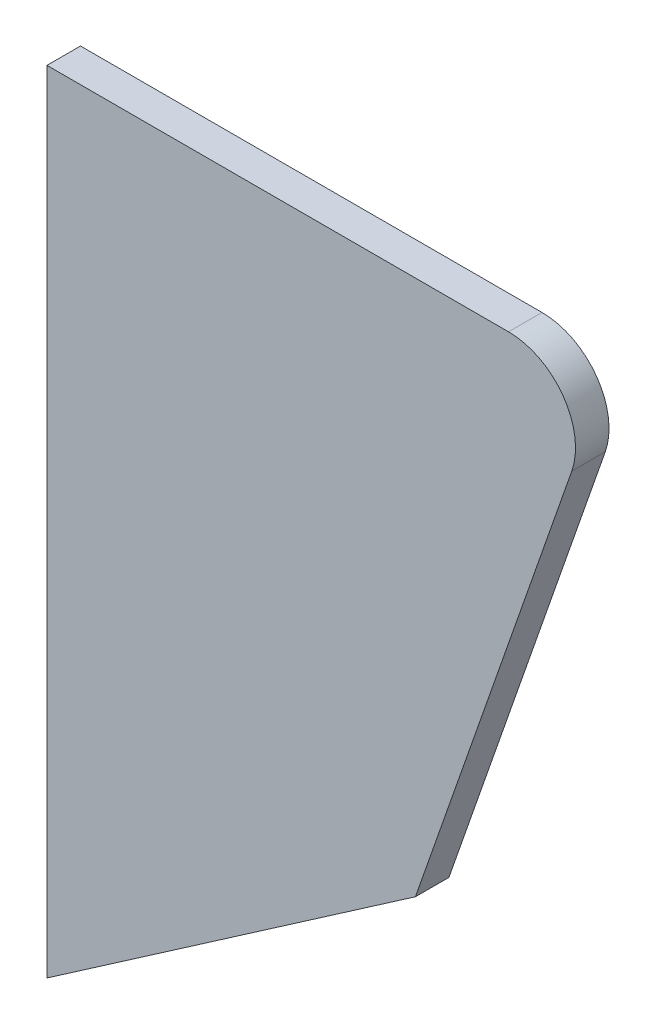
ISO-10303-21;
HEADER;
FILE_DESCRIPTION(('STEP AP214'),'2;1');
FILE_NAME('part.step','',(''),(''),'','','');
FILE_SCHEMA(('AUTOMOTIVE_DESIGN { 1 0 10303 214 1 1 1 1 }'));
ENDSEC;
DATA;
#1=APPLICATION_CONTEXT('core data for automotive mechanical design processes');
#2=APPLICATION_PROTOCOL_DEFINITION('international standard','automotive_design',2000,#1);
#3=PRODUCT_CONTEXT('',#1,'mechanical');
#4=PRODUCT('Part','Part','',(#3));
#5=PRODUCT_RELATED_PRODUCT_CATEGORY('part','',(#4));
#6=PRODUCT_DEFINITION_FORMATION('','',#4);
#7=PRODUCT_DEFINITION_CONTEXT('part definition',#1,'design');
#8=PRODUCT_DEFINITION('design','',#6,#7);
#9=PRODUCT_DEFINITION_SHAPE('','',#8);
#10=(LENGTH_UNIT() NAMED_UNIT(*) SI_UNIT(.MILLI.,.METRE.));
#11=(NAMED_UNIT(*) PLANE_ANGLE_UNIT() SI_UNIT($,.RADIAN.));
#12=(NAMED_UNIT(*) SI_UNIT($,.STERADIAN.) SOLID_ANGLE_UNIT());
#13=UNCERTAINTY_MEASURE_WITH_UNIT(LENGTH_MEASURE(1.E-05),#10,'distance_accuracy_value','');
#14=(GEOMETRIC_REPRESENTATION_CONTEXT(3) GLOBAL_UNCERTAINTY_ASSIGNED_CONTEXT((#13)) GLOBAL_UNIT_ASSIGNED_CONTEXT((#10,
#11,#12)) REPRESENTATION_CONTEXT('',''));
#15=CARTESIAN_POINT('',(0.,0.,0.));
#16=DIRECTION('',(0.,0.,1.));
#17=DIRECTION('',(1.,0.,0.));
#18=AXIS2_PLACEMENT_3D('',#15,#16,#17);
#19=CARTESIAN_POINT('',(13.5,0.,5.));
#20=DIRECTION('',(-0.568431869955349,0.822730338093269,0.));
#21=DIRECTION('',(-0.822730338093269,-0.568431869955349,0.));
#22=AXIS2_PLACEMENT_3D('',#19,#20,#21);
#23=PLANE('',#22);
#24=DIRECTION('',(0.822730338093269,0.568431869955349,0.));
#25=VECTOR('',#24,1.);
#26=CARTESIAN_POINT('',(13.5,0.,0.));
#27=LINE('',#26,#25);
#28=CARTESIAN_POINT('',(-41.5,-38.,0.));
#29=VERTEX_POINT('',#28);
#30=CARTESIAN_POINT('',(13.5,0.,0.));
#31=VERTEX_POINT('',#30);
#32=EDGE_CURVE('E118',#29,#31,#27,.T.);
#33=ORIENTED_EDGE('',*,*,#32,.T.);
#34=DIRECTION('',(0.,0.,-1.));
#35=VECTOR('',#34,1.);
#36=CARTESIAN_POINT('',(13.5,0.,5.));
#37=LINE('',#36,#35);
#38=CARTESIAN_POINT('',(13.5,0.,5.));
#39=VERTEX_POINT('',#38);
#40=EDGE_CURVE('E11',#39,#31,#37,.T.);
#41=ORIENTED_EDGE('',*,*,#40,.F.);
#42=DIRECTION('',(0.822730338093269,0.568431869955349,0.));
#43=VECTOR('',#42,1.);
#44=CARTESIAN_POINT('',(13.5,0.,5.));
#45=LINE('',#44,#43);
#46=CARTESIAN_POINT('',(-41.5,-38.,5.));
#47=VERTEX_POINT('',#46);
#48=EDGE_CURVE('E131',#47,#39,#45,.T.);
#49=ORIENTED_EDGE('',*,*,#48,.F.);
#50=DIRECTION('',(0.,0.,-1.));
#51=VECTOR('',#50,1.);
#52=CARTESIAN_POINT('',(-41.5,-38.,5.));
#53=LINE('',#52,#51);
#54=EDGE_CURVE('E114',#47,#29,#53,.T.);
#55=ORIENTED_EDGE('',*,*,#54,.T.);
#56=EDGE_LOOP('',(#33,#41,#49,#55));
#57=FACE_BOUND('',#56,.T.);
#58=ADVANCED_FACE('F39',(#57),#23,.F.);
#59=CARTESIAN_POINT('',(36.8437735134516,66.6964957527189,5.));
#60=DIRECTION('',(-0.943858356366017,0.330350424728106,0.));
#61=DIRECTION('',(-0.330350424728106,-0.943858356366017,0.));
#62=AXIS2_PLACEMENT_3D('',#59,#60,#61);
#63=PLANE('',#62);
#64=DIRECTION('',(0.330350424728106,0.943858356366017,0.));
#65=VECTOR('',#64,1.);
#66=CARTESIAN_POINT('',(36.8437735134516,66.6964957527189,0.));
#67=LINE('',#66,#65);
#68=CARTESIAN_POINT('',(36.8437735134516,66.6964957527189,0.));
#69=VERTEX_POINT('',#68);
#70=EDGE_CURVE('E122',#31,#69,#67,.T.);
#71=ORIENTED_EDGE('',*,*,#70,.T.);
#72=DIRECTION('',(0.,0.,-1.));
#73=VECTOR('',#72,1.);
#74=CARTESIAN_POINT('',(36.8437735134516,66.6964957527189,5.));
#75=LINE('',#74,#73);
#76=CARTESIAN_POINT('',(36.8437735134516,66.6964957527189,5.));
#77=VERTEX_POINT('',#76);
#78=EDGE_CURVE('E48',#77,#69,#75,.T.);
#79=ORIENTED_EDGE('',*,*,#78,.F.);
#80=DIRECTION('',(0.330350424728106,0.943858356366017,0.));
#81=VECTOR('',#80,1.);
#82=CARTESIAN_POINT('',(36.8437735134516,66.6964957527189,5.));
#83=LINE('',#82,#81);
#84=EDGE_CURVE('E90',#39,#77,#83,.T.);
#85=ORIENTED_EDGE('',*,*,#84,.F.);
#86=ORIENTED_EDGE('',*,*,#40,.T.);
#87=EDGE_LOOP('',(#71,#79,#85,#86));
#88=FACE_BOUND('',#87,.T.);
#89=ADVANCED_FACE('F153',(#88),#63,.F.);
#90=CARTESIAN_POINT('',(27.4051899497915,70.,5.));
#91=DIRECTION('',(0.,0.,-1.));
#92=DIRECTION('',(-1.,0.,0.));
#93=AXIS2_PLACEMENT_3D('',#90,#91,#92);
#94=CYLINDRICAL_SURFACE('',#93,10.);
#95=CARTESIAN_POINT('',(27.4051899497915,70.,0.));
#96=DIRECTION('',(0.,0.,1.));
#97=DIRECTION('',(-1.,0.,0.));
#98=AXIS2_PLACEMENT_3D('',#95,#96,#97);
#99=CIRCLE('',#98,10.);
#100=CARTESIAN_POINT('',(27.4051899497914,80.,0.));
#101=VERTEX_POINT('',#100);
#102=EDGE_CURVE('E106',#69,#101,#99,.T.);
#103=ORIENTED_EDGE('',*,*,#102,.T.);
#104=DIRECTION('',(0.,0.,-1.));
#105=VECTOR('',#104,1.);
#106=CARTESIAN_POINT('',(27.4051899497914,80.,5.));
#107=LINE('',#106,#105);
#108=CARTESIAN_POINT('',(27.4051899497914,80.,5.));
#109=VERTEX_POINT('',#108);
#110=EDGE_CURVE('E103',#109,#101,#107,.T.);
#111=ORIENTED_EDGE('',*,*,#110,.F.);
#112=CARTESIAN_POINT('',(27.4051899497915,70.,5.));
#113=DIRECTION('',(0.,0.,1.));
#114=DIRECTION('',(-1.,0.,0.));
#115=AXIS2_PLACEMENT_3D('',#112,#113,#114);
#116=CIRCLE('',#115,10.);
#117=EDGE_CURVE('E94',#77,#109,#116,.T.);
#118=ORIENTED_EDGE('',*,*,#117,.F.);
#119=ORIENTED_EDGE('',*,*,#78,.T.);
#120=EDGE_LOOP('',(#103,#111,#118,#119));
#121=FACE_BOUND('',#120,.T.);
#122=ADVANCED_FACE('F104',(#121),#94,.T.);
#123=CARTESIAN_POINT('',(-41.5,80.,5.));
#124=DIRECTION('',(0.,-1.,0.));
#125=DIRECTION('',(1.,0.,0.));
#126=AXIS2_PLACEMENT_3D('',#123,#124,#125);
#127=PLANE('',#126);
#128=DIRECTION('',(-1.,0.,0.));
#129=VECTOR('',#128,1.);
#130=CARTESIAN_POINT('',(-41.5,80.,0.));
#131=LINE('',#130,#129);
#132=CARTESIAN_POINT('',(-41.5,80.,0.));
#133=VERTEX_POINT('',#132);
#134=EDGE_CURVE('E76',#101,#133,#131,.T.);
#135=ORIENTED_EDGE('',*,*,#134,.T.);
#136=DIRECTION('',(0.,0.,-1.));
#137=VECTOR('',#136,1.);
#138=CARTESIAN_POINT('',(-41.5,80.,5.));
#139=LINE('',#138,#137);
#140=CARTESIAN_POINT('',(-41.5,80.,5.));
#141=VERTEX_POINT('',#140);
#142=EDGE_CURVE('E108',#141,#133,#139,.T.);
#143=ORIENTED_EDGE('',*,*,#142,.F.);
#144=DIRECTION('',(-1.,0.,0.));
#145=VECTOR('',#144,1.);
#146=CARTESIAN_POINT('',(-41.5,80.,5.));
#147=LINE('',#146,#145);
#148=EDGE_CURVE('E98',#109,#141,#147,.T.);
#149=ORIENTED_EDGE('',*,*,#148,.F.);
#150=ORIENTED_EDGE('',*,*,#110,.T.);
#151=EDGE_LOOP('',(#135,#143,#149,#150));
#152=FACE_BOUND('',#151,.T.);
#153=ADVANCED_FACE('F110',(#152),#127,.F.);
#154=CARTESIAN_POINT('',(-41.5,-38.,5.));
#155=DIRECTION('',(1.,0.,0.));
#156=DIRECTION('',(0.,0.,-1.));
#157=AXIS2_PLACEMENT_3D('',#154,#155,#156);
#158=PLANE('',#157);
#159=DIRECTION('',(0.,-1.,0.));
#160=VECTOR('',#159,1.);
#161=CARTESIAN_POINT('',(-41.5,-38.,0.));
#162=LINE('',#161,#160);
#163=EDGE_CURVE('E82',#133,#29,#162,.T.);
#164=ORIENTED_EDGE('',*,*,#163,.T.);
#165=ORIENTED_EDGE('',*,*,#54,.F.);
#166=DIRECTION('',(0.,-1.,0.));
#167=VECTOR('',#166,1.);
#168=CARTESIAN_POINT('',(-41.5,-38.,5.));
#169=LINE('',#168,#167);
#170=EDGE_CURVE('E56',#141,#47,#169,.T.);
#171=ORIENTED_EDGE('',*,*,#170,.F.);
#172=ORIENTED_EDGE('',*,*,#142,.T.);
#173=EDGE_LOOP('',(#164,#165,#171,#172));
#174=FACE_BOUND('',#173,.T.);
#175=ADVANCED_FACE('F142',(#174),#158,.F.);
#176=CARTESIAN_POINT('',(27.4051899497915,70.,5.));
#177=DIRECTION('',(0.,0.,-1.));
#178=DIRECTION('',(-1.,0.,0.));
#179=AXIS2_PLACEMENT_3D('',#176,#177,#178);
#180=PLANE('',#179);
#181=ORIENTED_EDGE('',*,*,#48,.T.);
#182=ORIENTED_EDGE('',*,*,#84,.T.);
#183=ORIENTED_EDGE('',*,*,#117,.T.);
#184=ORIENTED_EDGE('',*,*,#148,.T.);
#185=ORIENTED_EDGE('',*,*,#170,.T.);
#186=EDGE_LOOP('',(#181,#182,#183,#184,#185));
#187=FACE_BOUND('',#186,.T.);
#188=ADVANCED_FACE('F96',(#187),#180,.F.);
#189=CARTESIAN_POINT('',(27.4051899497915,70.,0.));
#190=DIRECTION('',(0.,0.,-1.));
#191=DIRECTION('',(-1.,0.,0.));
#192=AXIS2_PLACEMENT_3D('',#189,#190,#191);
#193=PLANE('',#192);
#194=ORIENTED_EDGE('',*,*,#32,.F.);
#195=ORIENTED_EDGE('',*,*,#163,.F.);
#196=ORIENTED_EDGE('',*,*,#134,.F.);
#197=ORIENTED_EDGE('',*,*,#102,.F.);
#198=ORIENTED_EDGE('',*,*,#70,.F.);
#199=EDGE_LOOP('',(#194,#195,#196,#197,#198));
#200=FACE_BOUND('',#199,.T.);
#201=ADVANCED_FACE('F138',(#200),#193,.T.);
#202=CLOSED_SHELL('',(#58,#89,#122,#153,#175,#188,#201));
#203=MANIFOLD_SOLID_BREP('B2',#202);
#204=ADVANCED_BREP_SHAPE_REPRESENTATION('',(#18,#203),#14);
#205=SHAPE_DEFINITION_REPRESENTATION(#9,#204);
ENDSEC;
END-ISO-10303-21;
